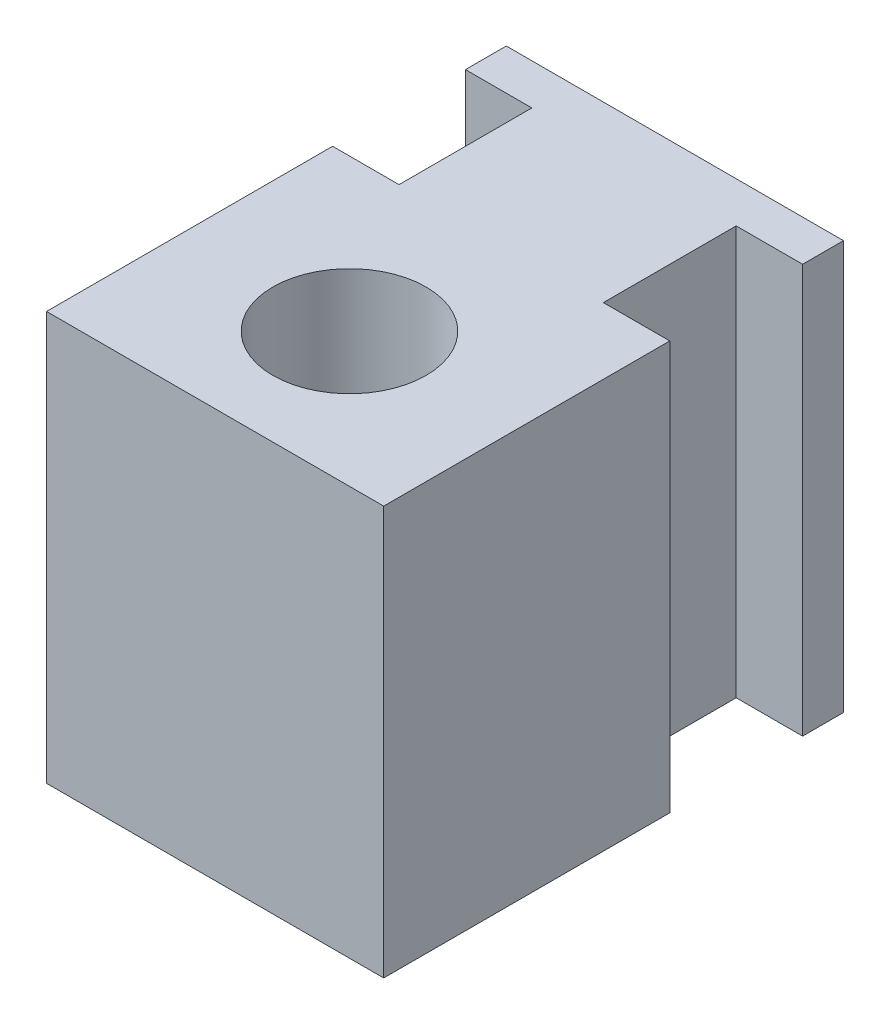
ISO-10303-21;
HEADER;
FILE_DESCRIPTION(('STEP AP214'),'2;1');
FILE_NAME('part.step','',(''),(''),'','','');
FILE_SCHEMA(('AUTOMOTIVE_DESIGN { 1 0 10303 214 1 1 1 1 }'));
ENDSEC;
DATA;
#1=APPLICATION_CONTEXT('core data for automotive mechanical design processes');
#2=APPLICATION_PROTOCOL_DEFINITION('international standard','automotive_design',2000,#1);
#3=PRODUCT_CONTEXT('',#1,'mechanical');
#4=PRODUCT('Part','Part','',(#3));
#5=PRODUCT_RELATED_PRODUCT_CATEGORY('part','',(#4));
#6=PRODUCT_DEFINITION_FORMATION('','',#4);
#7=PRODUCT_DEFINITION_CONTEXT('part definition',#1,'design');
#8=PRODUCT_DEFINITION('design','',#6,#7);
#9=PRODUCT_DEFINITION_SHAPE('','',#8);
#10=(LENGTH_UNIT() NAMED_UNIT(*) SI_UNIT(.MILLI.,.METRE.));
#11=(NAMED_UNIT(*) PLANE_ANGLE_UNIT() SI_UNIT($,.RADIAN.));
#12=(NAMED_UNIT(*) SI_UNIT($,.STERADIAN.) SOLID_ANGLE_UNIT());
#13=UNCERTAINTY_MEASURE_WITH_UNIT(LENGTH_MEASURE(1.E-05),#10,'distance_accuracy_value','');
#14=(GEOMETRIC_REPRESENTATION_CONTEXT(3) GLOBAL_UNCERTAINTY_ASSIGNED_CONTEXT((#13)) GLOBAL_UNIT_ASSIGNED_CONTEXT((#10,
#11,#12)) REPRESENTATION_CONTEXT('',''));
#15=CARTESIAN_POINT('',(0.,0.,0.));
#16=DIRECTION('',(0.,0.,1.));
#17=DIRECTION('',(1.,0.,0.));
#18=AXIS2_PLACEMENT_3D('',#15,#16,#17);
#19=CARTESIAN_POINT('',(-16.5,20.,0.));
#20=DIRECTION('',(1.,0.,0.));
#21=DIRECTION('',(0.,0.,-1.));
#22=AXIS2_PLACEMENT_3D('',#19,#20,#21);
#23=PLANE('',#22);
#24=DIRECTION('',(0.,1.,0.));
#25=VECTOR('',#24,1.);
#26=CARTESIAN_POINT('',(-16.5,-20.,-28.));
#27=LINE('',#26,#25);
#28=CARTESIAN_POINT('',(-16.5,-20.,-28.));
#29=VERTEX_POINT('',#28);
#30=CARTESIAN_POINT('',(-16.5,20.,-28.));
#31=VERTEX_POINT('',#30);
#32=EDGE_CURVE('E145',#29,#31,#27,.T.);
#33=ORIENTED_EDGE('',*,*,#32,.F.);
#34=DIRECTION('',(0.,0.,1.));
#35=VECTOR('',#34,1.);
#36=CARTESIAN_POINT('',(-16.5,-20.,0.));
#37=LINE('',#36,#35);
#38=CARTESIAN_POINT('',(-16.5,-20.,0.));
#39=VERTEX_POINT('',#38);
#40=EDGE_CURVE('E155',#29,#39,#37,.T.);
#41=ORIENTED_EDGE('',*,*,#40,.T.);
#42=DIRECTION('',(0.,-1.,0.));
#43=VECTOR('',#42,1.);
#44=CARTESIAN_POINT('',(-16.5,20.,0.));
#45=LINE('',#44,#43);
#46=CARTESIAN_POINT('',(-16.5,20.,0.));
#47=VERTEX_POINT('',#46);
#48=EDGE_CURVE('E11',#47,#39,#45,.T.);
#49=ORIENTED_EDGE('',*,*,#48,.F.);
#50=DIRECTION('',(0.,0.,1.));
#51=VECTOR('',#50,1.);
#52=CARTESIAN_POINT('',(-16.5,20.,0.));
#53=LINE('',#52,#51);
#54=EDGE_CURVE('E160',#31,#47,#53,.T.);
#55=ORIENTED_EDGE('',*,*,#54,.F.);
#56=EDGE_LOOP('',(#33,#41,#49,#55));
#57=FACE_BOUND('',#56,.T.);
#58=ADVANCED_FACE('F50',(#57),#23,.F.);
#59=CARTESIAN_POINT('',(16.5,20.,0.));
#60=DIRECTION('',(-1.,0.,0.));
#61=DIRECTION('',(0.,0.,1.));
#62=AXIS2_PLACEMENT_3D('',#59,#60,#61);
#63=PLANE('',#62);
#64=DIRECTION('',(0.,1.,0.));
#65=VECTOR('',#64,1.);
#66=CARTESIAN_POINT('',(16.5,-20.,-41.));
#67=LINE('',#66,#65);
#68=CARTESIAN_POINT('',(16.5,-20.,-41.));
#69=VERTEX_POINT('',#68);
#70=CARTESIAN_POINT('',(16.5,20.,-41.));
#71=VERTEX_POINT('',#70);
#72=EDGE_CURVE('E198',#69,#71,#67,.T.);
#73=ORIENTED_EDGE('',*,*,#72,.F.);
#74=DIRECTION('',(0.,0.,-1.));
#75=VECTOR('',#74,1.);
#76=CARTESIAN_POINT('',(16.5,-20.,0.));
#77=LINE('',#76,#75);
#78=CARTESIAN_POINT('',(16.5,-20.,-45.));
#79=VERTEX_POINT('',#78);
#80=EDGE_CURVE('E172',#69,#79,#77,.T.);
#81=ORIENTED_EDGE('',*,*,#80,.T.);
#82=DIRECTION('',(0.,-1.,0.));
#83=VECTOR('',#82,1.);
#84=CARTESIAN_POINT('',(16.5,20.,-45.));
#85=LINE('',#84,#83);
#86=CARTESIAN_POINT('',(16.5,20.,-45.));
#87=VERTEX_POINT('',#86);
#88=EDGE_CURVE('E182',#87,#79,#85,.T.);
#89=ORIENTED_EDGE('',*,*,#88,.F.);
#90=DIRECTION('',(0.,0.,-1.));
#91=VECTOR('',#90,1.);
#92=CARTESIAN_POINT('',(16.5,20.,0.));
#93=LINE('',#92,#91);
#94=EDGE_CURVE('E222',#71,#87,#93,.T.);
#95=ORIENTED_EDGE('',*,*,#94,.F.);
#96=EDGE_LOOP('',(#73,#81,#89,#95));
#97=FACE_BOUND('',#96,.T.);
#98=ADVANCED_FACE('F240',(#97),#63,.F.);
#99=CARTESIAN_POINT('',(0.,20.,0.));
#100=DIRECTION('',(0.,-1.,0.));
#101=DIRECTION('',(0.,0.,-1.));
#102=AXIS2_PLACEMENT_3D('',#99,#100,#101);
#103=PLANE('',#102);
#104=CARTESIAN_POINT('',(0.,20.,-13.15));
#105=DIRECTION('',(0.,1.,0.));
#106=DIRECTION('',(0.,0.,1.));
#107=AXIS2_PLACEMENT_3D('',#104,#105,#106);
#108=CIRCLE('',#107,7.5);
#109=CARTESIAN_POINT('',(0.,20.,-5.65000000000001));
#110=VERTEX_POINT('',#109);
#111=EDGE_CURVE('E170',#110,#110,#108,.T.);
#112=ORIENTED_EDGE('',*,*,#111,.F.);
#113=EDGE_LOOP('',(#112));
#114=FACE_BOUND('',#113,.T.);
#115=DIRECTION('',(1.,0.,0.));
#116=VECTOR('',#115,1.);
#117=CARTESIAN_POINT('',(-16.5,20.,-28.));
#118=LINE('',#117,#116);
#119=CARTESIAN_POINT('',(-10.,20.,-28.));
#120=VERTEX_POINT('',#119);
#121=EDGE_CURVE('E252',#31,#120,#118,.T.);
#122=ORIENTED_EDGE('',*,*,#121,.F.);
#123=ORIENTED_EDGE('',*,*,#54,.T.);
#124=DIRECTION('',(1.,0.,0.));
#125=VECTOR('',#124,1.);
#126=CARTESIAN_POINT('',(-16.5,20.,0.));
#127=LINE('',#126,#125);
#128=CARTESIAN_POINT('',(16.5,20.,0.));
#129=VERTEX_POINT('',#128);
#130=EDGE_CURVE('E223',#47,#129,#127,.T.);
#131=ORIENTED_EDGE('',*,*,#130,.T.);
#132=CARTESIAN_POINT('',(16.5,20.,-28.));
#133=VERTEX_POINT('',#132);
#134=EDGE_CURVE('E195',#129,#133,#93,.T.);
#135=ORIENTED_EDGE('',*,*,#134,.T.);
#136=DIRECTION('',(1.,0.,0.));
#137=VECTOR('',#136,1.);
#138=CARTESIAN_POINT('',(16.5,20.,-28.));
#139=LINE('',#138,#137);
#140=CARTESIAN_POINT('',(9.99999999999999,20.,-28.));
#141=VERTEX_POINT('',#140);
#142=EDGE_CURVE('E208',#141,#133,#139,.T.);
#143=ORIENTED_EDGE('',*,*,#142,.F.);
#144=DIRECTION('',(0.,0.,1.));
#145=VECTOR('',#144,1.);
#146=CARTESIAN_POINT('',(9.99999999999999,20.,-41.));
#147=LINE('',#146,#145);
#148=CARTESIAN_POINT('',(9.99999999999999,20.,-41.));
#149=VERTEX_POINT('',#148);
#150=EDGE_CURVE('E263',#149,#141,#147,.T.);
#151=ORIENTED_EDGE('',*,*,#150,.F.);
#152=DIRECTION('',(-1.,0.,0.));
#153=VECTOR('',#152,1.);
#154=CARTESIAN_POINT('',(16.5,20.,-41.));
#155=LINE('',#154,#153);
#156=EDGE_CURVE('E207',#71,#149,#155,.T.);
#157=ORIENTED_EDGE('',*,*,#156,.F.);
#158=ORIENTED_EDGE('',*,*,#94,.T.);
#159=DIRECTION('',(-1.,0.,0.));
#160=VECTOR('',#159,1.);
#161=CARTESIAN_POINT('',(-16.5,20.,-45.));
#162=LINE('',#161,#160);
#163=CARTESIAN_POINT('',(-16.5,20.,-45.));
#164=VERTEX_POINT('',#163);
#165=EDGE_CURVE('E171',#87,#164,#162,.T.);
#166=ORIENTED_EDGE('',*,*,#165,.T.);
#167=CARTESIAN_POINT('',(-16.5,20.,-41.));
#168=VERTEX_POINT('',#167);
#169=EDGE_CURVE('E220',#164,#168,#53,.T.);
#170=ORIENTED_EDGE('',*,*,#169,.T.);
#171=DIRECTION('',(-1.,0.,0.));
#172=VECTOR('',#171,1.);
#173=CARTESIAN_POINT('',(-16.5,20.,-41.));
#174=LINE('',#173,#172);
#175=CARTESIAN_POINT('',(-10.,20.,-41.));
#176=VERTEX_POINT('',#175);
#177=EDGE_CURVE('E148',#176,#168,#174,.T.);
#178=ORIENTED_EDGE('',*,*,#177,.F.);
#179=DIRECTION('',(0.,0.,-1.));
#180=VECTOR('',#179,1.);
#181=CARTESIAN_POINT('',(-10.,20.,-41.));
#182=LINE('',#181,#180);
#183=EDGE_CURVE('E248',#120,#176,#182,.T.);
#184=ORIENTED_EDGE('',*,*,#183,.F.);
#185=EDGE_LOOP('',(#122,#123,#131,#135,#143,#151,#157,#158,#166,#170,#178,#184));
#186=FACE_BOUND('',#185,.T.);
#187=ADVANCED_FACE('F229',(#114,#186),#103,.F.);
#188=CARTESIAN_POINT('',(0.,-20.,0.));
#189=DIRECTION('',(0.,-1.,0.));
#190=DIRECTION('',(0.,0.,-1.));
#191=AXIS2_PLACEMENT_3D('',#188,#189,#190);
#192=PLANE('',#191);
#193=CARTESIAN_POINT('',(0.,-20.,-13.15));
#194=DIRECTION('',(0.,1.,0.));
#195=DIRECTION('',(0.,0.,1.));
#196=AXIS2_PLACEMENT_3D('',#193,#194,#195);
#197=CIRCLE('',#196,7.49999999999999);
#198=CARTESIAN_POINT('',(0.,-20.,-5.65000000000001));
#199=VERTEX_POINT('',#198);
#200=EDGE_CURVE('E161',#199,#199,#197,.T.);
#201=ORIENTED_EDGE('',*,*,#200,.T.);
#202=EDGE_LOOP('',(#201));
#203=FACE_BOUND('',#202,.T.);
#204=DIRECTION('',(0.,0.,-1.));
#205=VECTOR('',#204,1.);
#206=CARTESIAN_POINT('',(-10.,-20.,-41.));
#207=LINE('',#206,#205);
#208=CARTESIAN_POINT('',(-10.,-20.,-28.));
#209=VERTEX_POINT('',#208);
#210=CARTESIAN_POINT('',(-10.,-20.,-41.));
#211=VERTEX_POINT('',#210);
#212=EDGE_CURVE('E146',#209,#211,#207,.T.);
#213=ORIENTED_EDGE('',*,*,#212,.T.);
#214=DIRECTION('',(-1.,0.,0.));
#215=VECTOR('',#214,1.);
#216=CARTESIAN_POINT('',(-16.5,-20.,-41.));
#217=LINE('',#216,#215);
#218=CARTESIAN_POINT('',(-16.5,-20.,-41.));
#219=VERTEX_POINT('',#218);
#220=EDGE_CURVE('E65',#211,#219,#217,.T.);
#221=ORIENTED_EDGE('',*,*,#220,.T.);
#222=CARTESIAN_POINT('',(-16.5,-20.,-45.));
#223=VERTEX_POINT('',#222);
#224=EDGE_CURVE('E162',#223,#219,#37,.T.);
#225=ORIENTED_EDGE('',*,*,#224,.F.);
#226=DIRECTION('',(-1.,0.,0.));
#227=VECTOR('',#226,1.);
#228=CARTESIAN_POINT('',(-16.5,-20.,-45.));
#229=LINE('',#228,#227);
#230=EDGE_CURVE('E178',#79,#223,#229,.T.);
#231=ORIENTED_EDGE('',*,*,#230,.F.);
#232=ORIENTED_EDGE('',*,*,#80,.F.);
#233=DIRECTION('',(-1.,0.,0.));
#234=VECTOR('',#233,1.);
#235=CARTESIAN_POINT('',(16.5,-20.,-41.));
#236=LINE('',#235,#234);
#237=CARTESIAN_POINT('',(9.99999999999999,-20.,-41.));
#238=VERTEX_POINT('',#237);
#239=EDGE_CURVE('E201',#69,#238,#236,.T.);
#240=ORIENTED_EDGE('',*,*,#239,.T.);
#241=DIRECTION('',(0.,0.,1.));
#242=VECTOR('',#241,1.);
#243=CARTESIAN_POINT('',(9.99999999999999,-20.,-41.));
#244=LINE('',#243,#242);
#245=CARTESIAN_POINT('',(9.99999999999999,-20.,-28.));
#246=VERTEX_POINT('',#245);
#247=EDGE_CURVE('E199',#238,#246,#244,.T.);
#248=ORIENTED_EDGE('',*,*,#247,.T.);
#249=DIRECTION('',(1.,0.,0.));
#250=VECTOR('',#249,1.);
#251=CARTESIAN_POINT('',(16.5,-20.,-28.));
#252=LINE('',#251,#250);
#253=CARTESIAN_POINT('',(16.5,-20.,-28.));
#254=VERTEX_POINT('',#253);
#255=EDGE_CURVE('E70',#246,#254,#252,.T.);
#256=ORIENTED_EDGE('',*,*,#255,.T.);
#257=CARTESIAN_POINT('',(16.5,-20.,0.));
#258=VERTEX_POINT('',#257);
#259=EDGE_CURVE('E174',#258,#254,#77,.T.);
#260=ORIENTED_EDGE('',*,*,#259,.F.);
#261=DIRECTION('',(1.,0.,0.));
#262=VECTOR('',#261,1.);
#263=CARTESIAN_POINT('',(-16.5,-20.,0.));
#264=LINE('',#263,#262);
#265=EDGE_CURVE('E163',#39,#258,#264,.T.);
#266=ORIENTED_EDGE('',*,*,#265,.F.);
#267=ORIENTED_EDGE('',*,*,#40,.F.);
#268=DIRECTION('',(1.,0.,0.));
#269=VECTOR('',#268,1.);
#270=CARTESIAN_POINT('',(-16.5,-20.,-28.));
#271=LINE('',#270,#269);
#272=EDGE_CURVE('E138',#29,#209,#271,.T.);
#273=ORIENTED_EDGE('',*,*,#272,.T.);
#274=EDGE_LOOP('',(#213,#221,#225,#231,#232,#240,#248,#256,#260,#266,#267,#273));
#275=FACE_BOUND('',#274,.T.);
#276=ADVANCED_FACE('F157',(#203,#275),#192,.T.);
#277=ORIENTED_EDGE('',*,*,#224,.T.);
#278=DIRECTION('',(0.,1.,0.));
#279=VECTOR('',#278,1.);
#280=CARTESIAN_POINT('',(-16.5,-20.,-41.));
#281=LINE('',#280,#279);
#282=EDGE_CURVE('E213',#219,#168,#281,.T.);
#283=ORIENTED_EDGE('',*,*,#282,.T.);
#284=ORIENTED_EDGE('',*,*,#169,.F.);
#285=DIRECTION('',(0.,-1.,0.));
#286=VECTOR('',#285,1.);
#287=CARTESIAN_POINT('',(-16.5,20.,-45.));
#288=LINE('',#287,#286);
#289=EDGE_CURVE('E179',#164,#223,#288,.T.);
#290=ORIENTED_EDGE('',*,*,#289,.T.);
#291=EDGE_LOOP('',(#277,#283,#284,#290));
#292=FACE_BOUND('',#291,.T.);
#293=ADVANCED_FACE('F47',(#292),#23,.F.);
#294=CARTESIAN_POINT('',(-16.5,20.,0.));
#295=DIRECTION('',(0.,0.,-1.));
#296=DIRECTION('',(-1.,0.,0.));
#297=AXIS2_PLACEMENT_3D('',#294,#295,#296);
#298=PLANE('',#297);
#299=ORIENTED_EDGE('',*,*,#265,.T.);
#300=DIRECTION('',(0.,-1.,0.));
#301=VECTOR('',#300,1.);
#302=CARTESIAN_POINT('',(16.5,20.,0.));
#303=LINE('',#302,#301);
#304=EDGE_CURVE('E54',#129,#258,#303,.T.);
#305=ORIENTED_EDGE('',*,*,#304,.F.);
#306=ORIENTED_EDGE('',*,*,#130,.F.);
#307=ORIENTED_EDGE('',*,*,#48,.T.);
#308=EDGE_LOOP('',(#299,#305,#306,#307));
#309=FACE_BOUND('',#308,.T.);
#310=ADVANCED_FACE('F289',(#309),#298,.F.);
#311=ORIENTED_EDGE('',*,*,#259,.T.);
#312=DIRECTION('',(0.,1.,0.));
#313=VECTOR('',#312,1.);
#314=CARTESIAN_POINT('',(16.5,-20.,-28.));
#315=LINE('',#314,#313);
#316=EDGE_CURVE('E262',#254,#133,#315,.T.);
#317=ORIENTED_EDGE('',*,*,#316,.T.);
#318=ORIENTED_EDGE('',*,*,#134,.F.);
#319=ORIENTED_EDGE('',*,*,#304,.T.);
#320=EDGE_LOOP('',(#311,#317,#318,#319));
#321=FACE_BOUND('',#320,.T.);
#322=ADVANCED_FACE('F186',(#321),#63,.F.);
#323=CARTESIAN_POINT('',(-16.5,20.,-45.));
#324=DIRECTION('',(0.,0.,1.));
#325=DIRECTION('',(1.,0.,0.));
#326=AXIS2_PLACEMENT_3D('',#323,#324,#325);
#327=PLANE('',#326);
#328=CARTESIAN_POINT('',(0.,1.57859836313889E-13,-45.));
#329=DIRECTION('',(0.,0.,-1.));
#330=DIRECTION('',(-1.,0.,0.));
#331=AXIS2_PLACEMENT_3D('',#328,#329,#330);
#332=CIRCLE('',#331,4.24999999999999);
#333=CARTESIAN_POINT('',(-4.25,1.57859836313889E-13,-45.));
#334=VERTEX_POINT('',#333);
#335=EDGE_CURVE('E212',#334,#334,#332,.T.);
#336=ORIENTED_EDGE('',*,*,#335,.F.);
#337=EDGE_LOOP('',(#336));
#338=FACE_BOUND('',#337,.T.);
#339=ORIENTED_EDGE('',*,*,#230,.T.);
#340=ORIENTED_EDGE('',*,*,#289,.F.);
#341=ORIENTED_EDGE('',*,*,#165,.F.);
#342=ORIENTED_EDGE('',*,*,#88,.T.);
#343=EDGE_LOOP('',(#339,#340,#341,#342));
#344=FACE_BOUND('',#343,.T.);
#345=ADVANCED_FACE('F241',(#338,#344),#327,.F.);
#346=CARTESIAN_POINT('',(0.,20.,-13.15));
#347=DIRECTION('',(0.,1.,0.));
#348=DIRECTION('',(0.,0.,1.));
#349=AXIS2_PLACEMENT_3D('',#346,#347,#348);
#350=CYLINDRICAL_SURFACE('',#349,7.49999999999999);
#351=ORIENTED_EDGE('',*,*,#200,.F.);
#352=EDGE_LOOP('',(#351));
#353=FACE_BOUND('',#352,.T.);
#354=ORIENTED_EDGE('',*,*,#111,.T.);
#355=EDGE_LOOP('',(#354));
#356=FACE_BOUND('',#355,.T.);
#357=ADVANCED_FACE('F306',(#353,#356),#350,.F.);
#358=CARTESIAN_POINT('',(0.,1.57859836313889E-13,-27.5536576308671));
#359=DIRECTION('',(0.,0.,-1.));
#360=DIRECTION('',(-1.,0.,0.));
#361=AXIS2_PLACEMENT_3D('',#358,#359,#360);
#362=CONICAL_SURFACE('',#361,4.25,1.02974425867665);
#363=CARTESIAN_POINT('',(0.,1.57859836313889E-13,-25.));
#364=VERTEX_POINT('',#363);
#365=VERTEX_LOOP('',#364);
#366=FACE_BOUND('',#365,.T.);
#367=CARTESIAN_POINT('',(0.,1.57859836313889E-13,-27.5536576308671));
#368=DIRECTION('',(0.,0.,-1.));
#369=DIRECTION('',(-1.,0.,0.));
#370=AXIS2_PLACEMENT_3D('',#367,#368,#369);
#371=CIRCLE('',#370,4.25);
#372=CARTESIAN_POINT('',(-4.25000000000001,1.57859836313889E-13,-27.5536576308671));
#373=VERTEX_POINT('',#372);
#374=EDGE_CURVE('E211',#373,#373,#371,.T.);
#375=ORIENTED_EDGE('',*,*,#374,.T.);
#376=EDGE_LOOP('',(#375));
#377=FACE_BOUND('',#376,.T.);
#378=ADVANCED_FACE('F360',(#366,#377),#362,.F.);
#379=CARTESIAN_POINT('',(0.,1.57859836313889E-13,-45.));
#380=DIRECTION('',(0.,0.,-1.));
#381=DIRECTION('',(-1.,0.,0.));
#382=AXIS2_PLACEMENT_3D('',#379,#380,#381);
#383=CYLINDRICAL_SURFACE('',#382,4.24999999999999);
#384=ORIENTED_EDGE('',*,*,#374,.F.);
#385=EDGE_LOOP('',(#384));
#386=FACE_BOUND('',#385,.T.);
#387=ORIENTED_EDGE('',*,*,#335,.T.);
#388=EDGE_LOOP('',(#387));
#389=FACE_BOUND('',#388,.T.);
#390=ADVANCED_FACE('F318',(#386,#389),#383,.F.);
#391=CARTESIAN_POINT('',(16.5,-20.,-28.));
#392=DIRECTION('',(0.,0.,1.));
#393=DIRECTION('',(1.,0.,0.));
#394=AXIS2_PLACEMENT_3D('',#391,#392,#393);
#395=PLANE('',#394);
#396=ORIENTED_EDGE('',*,*,#142,.T.);
#397=ORIENTED_EDGE('',*,*,#316,.F.);
#398=ORIENTED_EDGE('',*,*,#255,.F.);
#399=DIRECTION('',(0.,1.,0.));
#400=VECTOR('',#399,1.);
#401=CARTESIAN_POINT('',(9.99999999999999,-20.,-28.));
#402=LINE('',#401,#400);
#403=EDGE_CURVE('E258',#246,#141,#402,.T.);
#404=ORIENTED_EDGE('',*,*,#403,.T.);
#405=EDGE_LOOP('',(#396,#397,#398,#404));
#406=FACE_BOUND('',#405,.T.);
#407=ADVANCED_FACE('F317',(#406),#395,.F.);
#408=CARTESIAN_POINT('',(9.99999999999999,-20.,-41.));
#409=DIRECTION('',(-1.,0.,0.));
#410=DIRECTION('',(0.,0.,1.));
#411=AXIS2_PLACEMENT_3D('',#408,#409,#410);
#412=PLANE('',#411);
#413=ORIENTED_EDGE('',*,*,#150,.T.);
#414=ORIENTED_EDGE('',*,*,#403,.F.);
#415=ORIENTED_EDGE('',*,*,#247,.F.);
#416=DIRECTION('',(0.,1.,0.));
#417=VECTOR('',#416,1.);
#418=CARTESIAN_POINT('',(9.99999999999999,-20.,-41.));
#419=LINE('',#418,#417);
#420=EDGE_CURVE('E203',#238,#149,#419,.T.);
#421=ORIENTED_EDGE('',*,*,#420,.T.);
#422=EDGE_LOOP('',(#413,#414,#415,#421));
#423=FACE_BOUND('',#422,.T.);
#424=ADVANCED_FACE('F281',(#423),#412,.F.);
#425=CARTESIAN_POINT('',(16.5,-20.,-41.));
#426=DIRECTION('',(0.,0.,-1.));
#427=DIRECTION('',(-1.,0.,0.));
#428=AXIS2_PLACEMENT_3D('',#425,#426,#427);
#429=PLANE('',#428);
#430=ORIENTED_EDGE('',*,*,#156,.T.);
#431=ORIENTED_EDGE('',*,*,#420,.F.);
#432=ORIENTED_EDGE('',*,*,#239,.F.);
#433=ORIENTED_EDGE('',*,*,#72,.T.);
#434=EDGE_LOOP('',(#430,#431,#432,#433));
#435=FACE_BOUND('',#434,.T.);
#436=ADVANCED_FACE('F274',(#435),#429,.F.);
#437=CARTESIAN_POINT('',(-16.5,-20.,-41.));
#438=DIRECTION('',(0.,0.,-1.));
#439=DIRECTION('',(-1.,0.,0.));
#440=AXIS2_PLACEMENT_3D('',#437,#438,#439);
#441=PLANE('',#440);
#442=ORIENTED_EDGE('',*,*,#177,.T.);
#443=ORIENTED_EDGE('',*,*,#282,.F.);
#444=ORIENTED_EDGE('',*,*,#220,.F.);
#445=DIRECTION('',(0.,1.,0.));
#446=VECTOR('',#445,1.);
#447=CARTESIAN_POINT('',(-10.,-20.,-41.));
#448=LINE('',#447,#446);
#449=EDGE_CURVE('E257',#211,#176,#448,.T.);
#450=ORIENTED_EDGE('',*,*,#449,.T.);
#451=EDGE_LOOP('',(#442,#443,#444,#450));
#452=FACE_BOUND('',#451,.T.);
#453=ADVANCED_FACE('F275',(#452),#441,.F.);
#454=CARTESIAN_POINT('',(-10.,-20.,-41.));
#455=DIRECTION('',(1.,0.,0.));
#456=DIRECTION('',(0.,0.,-1.));
#457=AXIS2_PLACEMENT_3D('',#454,#455,#456);
#458=PLANE('',#457);
#459=ORIENTED_EDGE('',*,*,#183,.T.);
#460=ORIENTED_EDGE('',*,*,#449,.F.);
#461=ORIENTED_EDGE('',*,*,#212,.F.);
#462=DIRECTION('',(0.,1.,0.));
#463=VECTOR('',#462,1.);
#464=CARTESIAN_POINT('',(-10.,-20.,-28.));
#465=LINE('',#464,#463);
#466=EDGE_CURVE('E144',#209,#120,#465,.T.);
#467=ORIENTED_EDGE('',*,*,#466,.T.);
#468=EDGE_LOOP('',(#459,#460,#461,#467));
#469=FACE_BOUND('',#468,.T.);
#470=ADVANCED_FACE('F272',(#469),#458,.F.);
#471=CARTESIAN_POINT('',(-16.5,-20.,-28.));
#472=DIRECTION('',(0.,0.,1.));
#473=DIRECTION('',(1.,0.,0.));
#474=AXIS2_PLACEMENT_3D('',#471,#472,#473);
#475=PLANE('',#474);
#476=ORIENTED_EDGE('',*,*,#121,.T.);
#477=ORIENTED_EDGE('',*,*,#466,.F.);
#478=ORIENTED_EDGE('',*,*,#272,.F.);
#479=ORIENTED_EDGE('',*,*,#32,.T.);
#480=EDGE_LOOP('',(#476,#477,#478,#479));
#481=FACE_BOUND('',#480,.T.);
#482=ADVANCED_FACE('F142',(#481),#475,.F.);
#483=CLOSED_SHELL('',(#58,#98,#187,#276,#293,#310,#322,#345,#357,#378,#390,#407,#424,#436,#453,
#470,#482));
#484=MANIFOLD_SOLID_BREP('B2',#483);
#485=ADVANCED_BREP_SHAPE_REPRESENTATION('',(#18,#484),#14);
#486=SHAPE_DEFINITION_REPRESENTATION(#9,#485);
ENDSEC;
END-ISO-10303-21;
